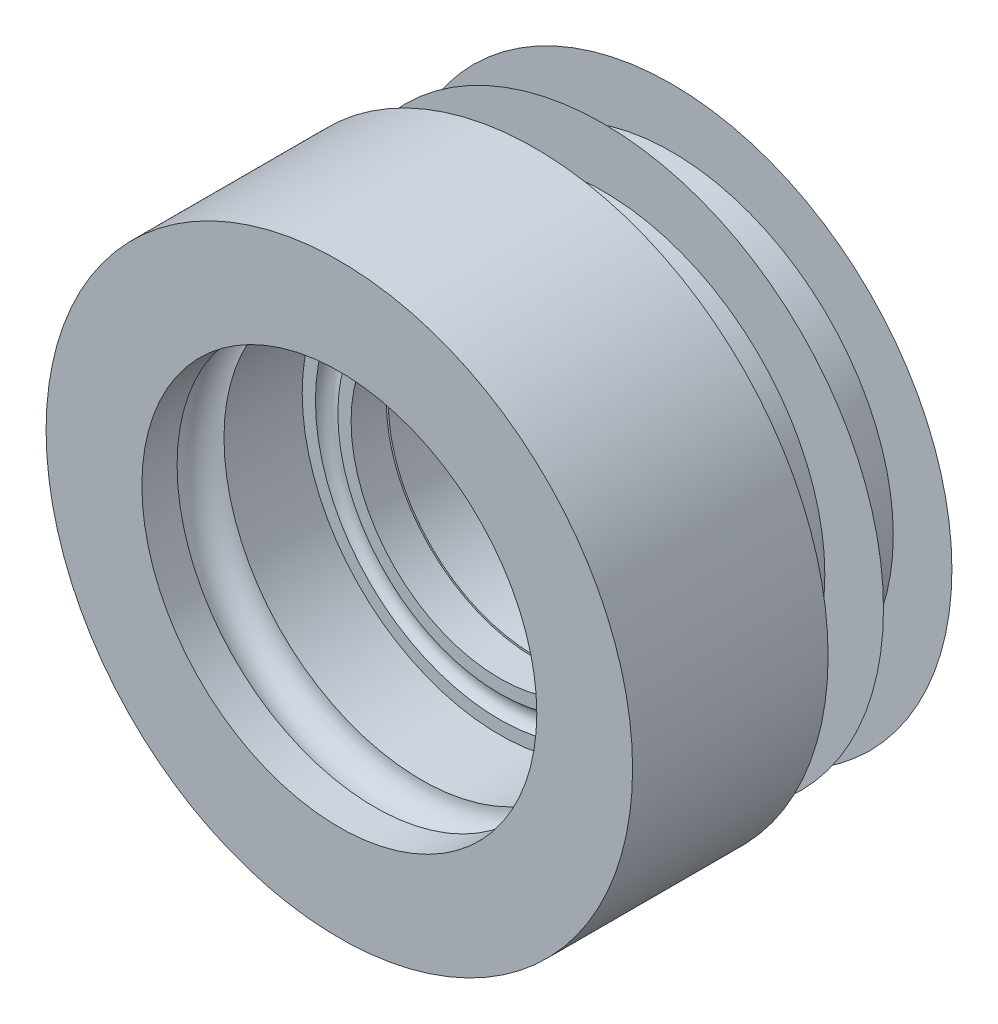
ISO-10303-21;
HEADER;
FILE_DESCRIPTION(('STEP AP214'),'2;1');
FILE_NAME('part.step','',(''),(''),'','','');
FILE_SCHEMA(('AUTOMOTIVE_DESIGN { 1 0 10303 214 1 1 1 1 }'));
ENDSEC;
DATA;
#1=APPLICATION_CONTEXT('core data for automotive mechanical design processes');
#2=APPLICATION_PROTOCOL_DEFINITION('international standard','automotive_design',2000,#1);
#3=PRODUCT_CONTEXT('',#1,'mechanical');
#4=PRODUCT('Part','Part','',(#3));
#5=PRODUCT_RELATED_PRODUCT_CATEGORY('part','',(#4));
#6=PRODUCT_DEFINITION_FORMATION('','',#4);
#7=PRODUCT_DEFINITION_CONTEXT('part definition',#1,'design');
#8=PRODUCT_DEFINITION('design','',#6,#7);
#9=PRODUCT_DEFINITION_SHAPE('','',#8);
#10=(LENGTH_UNIT() NAMED_UNIT(*) SI_UNIT(.MILLI.,.METRE.));
#11=(NAMED_UNIT(*) PLANE_ANGLE_UNIT() SI_UNIT($,.RADIAN.));
#12=(NAMED_UNIT(*) SI_UNIT($,.STERADIAN.) SOLID_ANGLE_UNIT());
#13=UNCERTAINTY_MEASURE_WITH_UNIT(LENGTH_MEASURE(1.E-05),#10,'distance_accuracy_value','');
#14=(GEOMETRIC_REPRESENTATION_CONTEXT(3) GLOBAL_UNCERTAINTY_ASSIGNED_CONTEXT((#13)) GLOBAL_UNIT_ASSIGNED_CONTEXT((#10,
#11,#12)) REPRESENTATION_CONTEXT('',''));
#15=CARTESIAN_POINT('',(0.,0.,0.));
#16=DIRECTION('',(0.,0.,1.));
#17=DIRECTION('',(1.,0.,0.));
#18=AXIS2_PLACEMENT_3D('',#15,#16,#17);
#19=CARTESIAN_POINT('',(0.,0.,-9.));
#20=DIRECTION('',(0.,0.,1.));
#21=DIRECTION('',(1.,0.,0.));
#22=AXIS2_PLACEMENT_3D('',#19,#20,#21);
#23=CYLINDRICAL_SURFACE('',#22,11.3326578733656);
#24=CARTESIAN_POINT('',(0.,0.,-5.5));
#25=DIRECTION('',(0.,0.,-1.));
#26=DIRECTION('',(-1.,0.,0.));
#27=AXIS2_PLACEMENT_3D('',#24,#25,#26);
#28=CIRCLE('',#27,11.3326578733656);
#29=CARTESIAN_POINT('',(-11.3326578733656,0.,-5.5));
#30=VERTEX_POINT('',#29);
#31=EDGE_CURVE('E160',#30,#30,#28,.T.);
#32=ORIENTED_EDGE('',*,*,#31,.T.);
#33=EDGE_LOOP('',(#32));
#34=FACE_BOUND('',#33,.T.);
#35=CARTESIAN_POINT('',(0.,0.,-7.));
#36=DIRECTION('',(0.,0.,-1.));
#37=DIRECTION('',(-1.,0.,0.));
#38=AXIS2_PLACEMENT_3D('',#35,#36,#37);
#39=CIRCLE('',#38,11.3326578733656);
#40=CARTESIAN_POINT('',(-11.3326578733656,0.,-7.));
#41=VERTEX_POINT('',#40);
#42=EDGE_CURVE('E73',#41,#41,#39,.T.);
#43=ORIENTED_EDGE('',*,*,#42,.F.);
#44=EDGE_LOOP('',(#43));
#45=FACE_BOUND('',#44,.T.);
#46=ADVANCED_FACE('F37',(#34,#45),#23,.T.);
#47=CARTESIAN_POINT('',(0.,0.,0.));
#48=DIRECTION('',(0.,0.,-1.));
#49=DIRECTION('',(-1.,0.,0.));
#50=AXIS2_PLACEMENT_3D('',#47,#48,#49);
#51=CYLINDRICAL_SURFACE('',#50,7.6);
#52=CARTESIAN_POINT('',(0.,0.,1.8));
#53=DIRECTION('',(0.,0.,-1.));
#54=DIRECTION('',(-1.,0.,0.));
#55=AXIS2_PLACEMENT_3D('',#52,#53,#54);
#56=CIRCLE('',#55,7.6);
#57=CARTESIAN_POINT('',(-7.6,0.,1.8));
#58=VERTEX_POINT('',#57);
#59=EDGE_CURVE('E77',#58,#58,#56,.T.);
#60=ORIENTED_EDGE('',*,*,#59,.F.);
#61=EDGE_LOOP('',(#60));
#62=FACE_BOUND('',#61,.T.);
#63=CARTESIAN_POINT('',(0.,0.,0.));
#64=DIRECTION('',(0.,0.,-1.));
#65=DIRECTION('',(-1.,0.,0.));
#66=AXIS2_PLACEMENT_3D('',#63,#64,#65);
#67=CIRCLE('',#66,7.6);
#68=CARTESIAN_POINT('',(-7.6,0.,0.));
#69=VERTEX_POINT('',#68);
#70=EDGE_CURVE('E10',#69,#69,#67,.F.);
#71=ORIENTED_EDGE('',*,*,#70,.F.);
#72=EDGE_LOOP('',(#71));
#73=FACE_BOUND('',#72,.T.);
#74=ADVANCED_FACE('F127',(#62,#73),#51,.F.);
#75=CARTESIAN_POINT('',(0.,-7.6,1.8));
#76=DIRECTION('',(0.,0.,-1.));
#77=DIRECTION('',(-1.,0.,0.));
#78=AXIS2_PLACEMENT_3D('',#75,#76,#77);
#79=PLANE('',#78);
#80=CARTESIAN_POINT('',(0.,0.,1.8));
#81=DIRECTION('',(0.,0.,-1.));
#82=DIRECTION('',(-1.,0.,0.));
#83=AXIS2_PLACEMENT_3D('',#80,#81,#82);
#84=CIRCLE('',#83,10.1);
#85=CARTESIAN_POINT('',(-10.1,0.,1.8));
#86=VERTEX_POINT('',#85);
#87=EDGE_CURVE('E45',#86,#86,#84,.F.);
#88=ORIENTED_EDGE('',*,*,#87,.T.);
#89=EDGE_LOOP('',(#88));
#90=FACE_BOUND('',#89,.T.);
#91=CARTESIAN_POINT('',(0.,0.,1.8));
#92=DIRECTION('',(0.,0.,-1.));
#93=DIRECTION('',(-1.,0.,0.));
#94=AXIS2_PLACEMENT_3D('',#91,#92,#93);
#95=CIRCLE('',#94,9.42282196186948);
#96=CARTESIAN_POINT('',(-9.42282196186948,0.,1.8));
#97=VERTEX_POINT('',#96);
#98=EDGE_CURVE('E53',#97,#97,#95,.T.);
#99=ORIENTED_EDGE('',*,*,#98,.T.);
#100=EDGE_LOOP('',(#99));
#101=FACE_BOUND('',#100,.T.);
#102=ADVANCED_FACE('F105',(#90,#101),#79,.F.);
#103=ORIENTED_EDGE('',*,*,#59,.T.);
#104=EDGE_LOOP('',(#103));
#105=FACE_BOUND('',#104,.T.);
#106=CARTESIAN_POINT('',(0.,0.,1.8));
#107=DIRECTION('',(0.,0.,1.));
#108=DIRECTION('',(1.,0.,0.));
#109=AXIS2_PLACEMENT_3D('',#106,#107,#108);
#110=CIRCLE('',#109,8.27717803813051);
#111=CARTESIAN_POINT('',(8.27717803813051,0.,1.8));
#112=VERTEX_POINT('',#111);
#113=EDGE_CURVE('E61',#112,#112,#110,.T.);
#114=ORIENTED_EDGE('',*,*,#113,.T.);
#115=EDGE_LOOP('',(#114));
#116=FACE_BOUND('',#115,.T.);
#117=ADVANCED_FACE('F200',(#105,#116),#79,.F.);
#118=CARTESIAN_POINT('',(0.,0.,0.));
#119=DIRECTION('',(0.,0.,1.));
#120=DIRECTION('',(1.,0.,0.));
#121=AXIS2_PLACEMENT_3D('',#118,#119,#120);
#122=CYLINDRICAL_SURFACE('',#121,10.1);
#123=CARTESIAN_POINT('',(0.,0.,5.8));
#124=DIRECTION('',(0.,0.,1.));
#125=DIRECTION('',(1.,0.,0.));
#126=AXIS2_PLACEMENT_3D('',#123,#124,#125);
#127=CIRCLE('',#126,10.1);
#128=CARTESIAN_POINT('',(10.1,0.,5.8));
#129=VERTEX_POINT('',#128);
#130=EDGE_CURVE('E91',#129,#129,#127,.T.);
#131=ORIENTED_EDGE('',*,*,#130,.T.);
#132=EDGE_LOOP('',(#131));
#133=FACE_BOUND('',#132,.T.);
#134=ORIENTED_EDGE('',*,*,#87,.F.);
#135=EDGE_LOOP('',(#134));
#136=FACE_BOUND('',#135,.T.);
#137=ADVANCED_FACE('F207',(#133,#136),#122,.F.);
#138=CARTESIAN_POINT('',(0.,0.,10.));
#139=DIRECTION('',(0.,0.,-1.));
#140=DIRECTION('',(-1.,0.,0.));
#141=AXIS2_PLACEMENT_3D('',#138,#139,#140);
#142=CYLINDRICAL_SURFACE('',#141,15.);
#143=CARTESIAN_POINT('',(0.,0.,10.));
#144=DIRECTION('',(0.,0.,1.));
#145=DIRECTION('',(1.,0.,0.));
#146=AXIS2_PLACEMENT_3D('',#143,#144,#145);
#147=CIRCLE('',#146,15.);
#148=CARTESIAN_POINT('',(15.,0.,10.));
#149=VERTEX_POINT('',#148);
#150=EDGE_CURVE('E50',#149,#149,#147,.T.);
#151=ORIENTED_EDGE('',*,*,#150,.F.);
#152=EDGE_LOOP('',(#151));
#153=FACE_BOUND('',#152,.T.);
#154=CARTESIAN_POINT('',(0.,0.,0.));
#155=DIRECTION('',(0.,0.,1.));
#156=DIRECTION('',(1.,0.,0.));
#157=AXIS2_PLACEMENT_3D('',#154,#155,#156);
#158=CIRCLE('',#157,15.);
#159=CARTESIAN_POINT('',(15.,0.,0.));
#160=VERTEX_POINT('',#159);
#161=EDGE_CURVE('E90',#160,#160,#158,.T.);
#162=ORIENTED_EDGE('',*,*,#161,.T.);
#163=EDGE_LOOP('',(#162));
#164=FACE_BOUND('',#163,.T.);
#165=ADVANCED_FACE('F39',(#153,#164),#142,.T.);
#166=CARTESIAN_POINT('',(0.,0.,10.));
#167=DIRECTION('',(0.,0.,1.));
#168=DIRECTION('',(1.,0.,0.));
#169=AXIS2_PLACEMENT_3D('',#166,#167,#168);
#170=PLANE('',#169);
#171=CARTESIAN_POINT('',(0.,0.,10.));
#172=DIRECTION('',(0.,0.,1.));
#173=DIRECTION('',(1.,0.,0.));
#174=AXIS2_PLACEMENT_3D('',#171,#172,#173);
#175=CIRCLE('',#174,10.1);
#176=CARTESIAN_POINT('',(10.1,0.,10.));
#177=VERTEX_POINT('',#176);
#178=EDGE_CURVE('E87',#177,#177,#175,.T.);
#179=ORIENTED_EDGE('',*,*,#178,.F.);
#180=EDGE_LOOP('',(#179));
#181=FACE_BOUND('',#180,.T.);
#182=ORIENTED_EDGE('',*,*,#150,.T.);
#183=EDGE_LOOP('',(#182));
#184=FACE_BOUND('',#183,.T.);
#185=ADVANCED_FACE('F208',(#181,#184),#170,.T.);
#186=CARTESIAN_POINT('',(0.,0.,0.));
#187=DIRECTION('',(0.,0.,1.));
#188=DIRECTION('',(1.,0.,0.));
#189=AXIS2_PLACEMENT_3D('',#186,#187,#188);
#190=PLANE('',#189);
#191=CARTESIAN_POINT('',(0.,0.,0.));
#192=DIRECTION('',(0.,0.,-1.));
#193=DIRECTION('',(-1.,0.,0.));
#194=AXIS2_PLACEMENT_3D('',#191,#192,#193);
#195=CIRCLE('',#194,14.3326578733656);
#196=CARTESIAN_POINT('',(-14.3326578733656,0.,0.));
#197=VERTEX_POINT('',#196);
#198=EDGE_CURVE('E217',#197,#197,#195,.T.);
#199=ORIENTED_EDGE('',*,*,#198,.F.);
#200=EDGE_LOOP('',(#199));
#201=FACE_BOUND('',#200,.T.);
#202=ORIENTED_EDGE('',*,*,#161,.F.);
#203=EDGE_LOOP('',(#202));
#204=FACE_BOUND('',#203,.T.);
#205=ADVANCED_FACE('F205',(#201,#204),#190,.F.);
#206=CARTESIAN_POINT('',(0.,0.,8.2));
#207=DIRECTION('',(0.,0.,-1.));
#208=DIRECTION('',(-1.,0.,0.));
#209=AXIS2_PLACEMENT_3D('',#206,#207,#208);
#210=CIRCLE('',#209,10.1);
#211=CARTESIAN_POINT('',(-10.1,0.,8.2));
#212=VERTEX_POINT('',#211);
#213=EDGE_CURVE('E86',#212,#212,#210,.T.);
#214=ORIENTED_EDGE('',*,*,#213,.T.);
#215=EDGE_LOOP('',(#214));
#216=FACE_BOUND('',#215,.T.);
#217=ORIENTED_EDGE('',*,*,#178,.T.);
#218=EDGE_LOOP('',(#217));
#219=FACE_BOUND('',#218,.T.);
#220=ADVANCED_FACE('F121',(#216,#219),#122,.F.);
#221=CARTESIAN_POINT('',(0.,0.,7.));
#222=DIRECTION('',(0.,0.,-1.));
#223=DIRECTION('',(-1.,0.,0.));
#224=AXIS2_PLACEMENT_3D('',#221,#222,#223);
#225=TOROIDAL_SURFACE('',#224,10.1,1.2);
#226=ORIENTED_EDGE('',*,*,#213,.F.);
#227=EDGE_LOOP('',(#226));
#228=FACE_BOUND('',#227,.T.);
#229=ORIENTED_EDGE('',*,*,#130,.F.);
#230=EDGE_LOOP('',(#229));
#231=FACE_BOUND('',#230,.T.);
#232=ADVANCED_FACE('F110',(#228,#231),#225,.F.);
#233=CARTESIAN_POINT('',(0.,0.,2.05));
#234=DIRECTION('',(0.,0.,-1.));
#235=DIRECTION('',(-1.,0.,0.));
#236=AXIS2_PLACEMENT_3D('',#233,#234,#235);
#237=TOROIDAL_SURFACE('',#236,8.85,0.625000000000002);
#238=ORIENTED_EDGE('',*,*,#113,.F.);
#239=EDGE_LOOP('',(#238));
#240=FACE_BOUND('',#239,.T.);
#241=ORIENTED_EDGE('',*,*,#98,.F.);
#242=EDGE_LOOP('',(#241));
#243=FACE_BOUND('',#242,.T.);
#244=ADVANCED_FACE('F107',(#240,#243),#237,.F.);
#245=CARTESIAN_POINT('',(0.,0.,0.));
#246=DIRECTION('',(0.,0.,-1.));
#247=DIRECTION('',(-1.,0.,0.));
#248=AXIS2_PLACEMENT_3D('',#245,#246,#247);
#249=PLANE('',#248);
#250=CARTESIAN_POINT('',(0.,0.,0.));
#251=DIRECTION('',(0.,0.,-1.));
#252=DIRECTION('',(-1.,0.,0.));
#253=AXIS2_PLACEMENT_3D('',#250,#251,#252);
#254=CIRCLE('',#253,7.5);
#255=CARTESIAN_POINT('',(-7.5,0.,0.));
#256=VERTEX_POINT('',#255);
#257=EDGE_CURVE('E41',#256,#256,#254,.T.);
#258=ORIENTED_EDGE('',*,*,#257,.T.);
#259=EDGE_LOOP('',(#258));
#260=FACE_BOUND('',#259,.T.);
#261=ORIENTED_EDGE('',*,*,#70,.T.);
#262=EDGE_LOOP('',(#261));
#263=FACE_BOUND('',#262,.T.);
#264=ADVANCED_FACE('F109',(#260,#263),#249,.F.);
#265=CARTESIAN_POINT('',(0.,0.,-9.));
#266=DIRECTION('',(0.,0.,-1.));
#267=DIRECTION('',(-1.,0.,0.));
#268=AXIS2_PLACEMENT_3D('',#265,#266,#267);
#269=PLANE('',#268);
#270=CARTESIAN_POINT('',(0.,0.,-9.));
#271=DIRECTION('',(0.,0.,-1.));
#272=DIRECTION('',(-1.,0.,0.));
#273=AXIS2_PLACEMENT_3D('',#270,#271,#272);
#274=CIRCLE('',#273,11.3326578733656);
#275=CARTESIAN_POINT('',(-11.3326578733656,0.,-9.));
#276=VERTEX_POINT('',#275);
#277=EDGE_CURVE('E68',#276,#276,#274,.T.);
#278=ORIENTED_EDGE('',*,*,#277,.T.);
#279=EDGE_LOOP('',(#278));
#280=FACE_BOUND('',#279,.T.);
#281=CARTESIAN_POINT('',(0.,0.,-9.));
#282=DIRECTION('',(0.,0.,-1.));
#283=DIRECTION('',(-1.,0.,0.));
#284=AXIS2_PLACEMENT_3D('',#281,#282,#283);
#285=CIRCLE('',#284,11.1);
#286=CARTESIAN_POINT('',(-11.1,0.,-9.));
#287=VERTEX_POINT('',#286);
#288=EDGE_CURVE('E57',#287,#287,#285,.T.);
#289=ORIENTED_EDGE('',*,*,#288,.F.);
#290=EDGE_LOOP('',(#289));
#291=FACE_BOUND('',#290,.T.);
#292=ADVANCED_FACE('F118',(#280,#291),#269,.T.);
#293=CARTESIAN_POINT('',(0.,0.,-2.));
#294=DIRECTION('',(0.,0.,-1.));
#295=DIRECTION('',(-1.,0.,0.));
#296=AXIS2_PLACEMENT_3D('',#293,#294,#295);
#297=CIRCLE('',#296,11.3326578733656);
#298=CARTESIAN_POINT('',(-11.3326578733656,0.,-2.));
#299=VERTEX_POINT('',#298);
#300=EDGE_CURVE('E155',#299,#299,#297,.T.);
#301=ORIENTED_EDGE('',*,*,#300,.T.);
#302=EDGE_LOOP('',(#301));
#303=FACE_BOUND('',#302,.T.);
#304=CARTESIAN_POINT('',(0.,0.,-3.5));
#305=DIRECTION('',(0.,0.,-1.));
#306=DIRECTION('',(-1.,0.,0.));
#307=AXIS2_PLACEMENT_3D('',#304,#305,#306);
#308=CIRCLE('',#307,11.3326578733656);
#309=CARTESIAN_POINT('',(-11.3326578733656,0.,-3.5));
#310=VERTEX_POINT('',#309);
#311=EDGE_CURVE('E158',#310,#310,#308,.T.);
#312=ORIENTED_EDGE('',*,*,#311,.F.);
#313=EDGE_LOOP('',(#312));
#314=FACE_BOUND('',#313,.T.);
#315=ADVANCED_FACE('F129',(#303,#314),#23,.T.);
#316=CARTESIAN_POINT('',(0.,0.,0.));
#317=DIRECTION('',(0.,0.,-1.));
#318=DIRECTION('',(-1.,0.,0.));
#319=AXIS2_PLACEMENT_3D('',#316,#317,#318);
#320=CYLINDRICAL_SURFACE('',#319,11.1);
#321=ORIENTED_EDGE('',*,*,#288,.T.);
#322=EDGE_LOOP('',(#321));
#323=FACE_BOUND('',#322,.T.);
#324=CARTESIAN_POINT('',(0.,0.,-9.2));
#325=DIRECTION('',(0.,0.,-1.));
#326=DIRECTION('',(-1.,0.,0.));
#327=AXIS2_PLACEMENT_3D('',#324,#325,#326);
#328=CIRCLE('',#327,11.1);
#329=CARTESIAN_POINT('',(-11.1,0.,-9.2));
#330=VERTEX_POINT('',#329);
#331=EDGE_CURVE('E83',#330,#330,#328,.T.);
#332=ORIENTED_EDGE('',*,*,#331,.F.);
#333=EDGE_LOOP('',(#332));
#334=FACE_BOUND('',#333,.T.);
#335=ADVANCED_FACE('F139',(#323,#334),#320,.T.);
#336=CARTESIAN_POINT('',(0.,-7.6,-9.2));
#337=DIRECTION('',(0.,0.,1.));
#338=DIRECTION('',(1.,0.,0.));
#339=AXIS2_PLACEMENT_3D('',#336,#337,#338);
#340=PLANE('',#339);
#341=CARTESIAN_POINT('',(0.,0.,-9.2));
#342=DIRECTION('',(0.,0.,-1.));
#343=DIRECTION('',(-1.,0.,0.));
#344=AXIS2_PLACEMENT_3D('',#341,#342,#343);
#345=CIRCLE('',#344,7.6);
#346=CARTESIAN_POINT('',(-7.6,0.,-9.2));
#347=VERTEX_POINT('',#346);
#348=EDGE_CURVE('E80',#347,#347,#345,.T.);
#349=ORIENTED_EDGE('',*,*,#348,.F.);
#350=EDGE_LOOP('',(#349));
#351=FACE_BOUND('',#350,.T.);
#352=ORIENTED_EDGE('',*,*,#331,.T.);
#353=EDGE_LOOP('',(#352));
#354=FACE_BOUND('',#353,.T.);
#355=ADVANCED_FACE('F145',(#351,#354),#340,.F.);
#356=CARTESIAN_POINT('',(0.,0.,-9.));
#357=DIRECTION('',(0.,0.,-1.));
#358=DIRECTION('',(-1.,0.,0.));
#359=AXIS2_PLACEMENT_3D('',#356,#357,#358);
#360=CIRCLE('',#359,7.6);
#361=CARTESIAN_POINT('',(-7.6,0.,-9.));
#362=VERTEX_POINT('',#361);
#363=EDGE_CURVE('E55',#362,#362,#360,.F.);
#364=ORIENTED_EDGE('',*,*,#363,.T.);
#365=EDGE_LOOP('',(#364));
#366=FACE_BOUND('',#365,.T.);
#367=ORIENTED_EDGE('',*,*,#348,.T.);
#368=EDGE_LOOP('',(#367));
#369=FACE_BOUND('',#368,.T.);
#370=ADVANCED_FACE('F135',(#366,#369),#51,.F.);
#371=CARTESIAN_POINT('',(0.,0.,-9.));
#372=DIRECTION('',(0.,0.,-1.));
#373=DIRECTION('',(-1.,0.,0.));
#374=AXIS2_PLACEMENT_3D('',#371,#372,#373);
#375=CIRCLE('',#374,7.5);
#376=CARTESIAN_POINT('',(-7.5,0.,-9.));
#377=VERTEX_POINT('',#376);
#378=EDGE_CURVE('E64',#377,#377,#375,.T.);
#379=ORIENTED_EDGE('',*,*,#378,.F.);
#380=EDGE_LOOP('',(#379));
#381=FACE_BOUND('',#380,.T.);
#382=ORIENTED_EDGE('',*,*,#363,.F.);
#383=EDGE_LOOP('',(#382));
#384=FACE_BOUND('',#383,.T.);
#385=ADVANCED_FACE('F151',(#381,#384),#269,.T.);
#386=CARTESIAN_POINT('',(0.,0.,10.));
#387=DIRECTION('',(0.,0.,-1.));
#388=DIRECTION('',(-1.,0.,0.));
#389=AXIS2_PLACEMENT_3D('',#386,#387,#388);
#390=CYLINDRICAL_SURFACE('',#389,7.5);
#391=ORIENTED_EDGE('',*,*,#378,.T.);
#392=EDGE_LOOP('',(#391));
#393=FACE_BOUND('',#392,.T.);
#394=ORIENTED_EDGE('',*,*,#257,.F.);
#395=EDGE_LOOP('',(#394));
#396=FACE_BOUND('',#395,.T.);
#397=ADVANCED_FACE('F182',(#393,#396),#390,.F.);
#398=CARTESIAN_POINT('',(0.,0.,-9.));
#399=DIRECTION('',(0.,0.,1.));
#400=DIRECTION('',(1.,0.,0.));
#401=AXIS2_PLACEMENT_3D('',#398,#399,#400);
#402=CONICAL_SURFACE('',#401,11.3326578733656,0.982793723247329);
#403=CARTESIAN_POINT('',(0.,0.,-7.));
#404=DIRECTION('',(0.,0.,-1.));
#405=DIRECTION('',(-1.,0.,0.));
#406=AXIS2_PLACEMENT_3D('',#403,#404,#405);
#407=CIRCLE('',#406,14.3326578733656);
#408=CARTESIAN_POINT('',(-14.3326578733656,0.,-7.));
#409=VERTEX_POINT('',#408);
#410=EDGE_CURVE('E163',#409,#409,#407,.T.);
#411=ORIENTED_EDGE('',*,*,#410,.T.);
#412=EDGE_LOOP('',(#411));
#413=FACE_BOUND('',#412,.T.);
#414=ORIENTED_EDGE('',*,*,#277,.F.);
#415=EDGE_LOOP('',(#414));
#416=FACE_BOUND('',#415,.T.);
#417=ADVANCED_FACE('F176',(#413,#416),#402,.T.);
#418=CARTESIAN_POINT('',(0.,11.3326578733656,-7.));
#419=DIRECTION('',(0.,0.,1.));
#420=DIRECTION('',(1.,0.,0.));
#421=AXIS2_PLACEMENT_3D('',#418,#419,#420);
#422=PLANE('',#421);
#423=ORIENTED_EDGE('',*,*,#42,.T.);
#424=EDGE_LOOP('',(#423));
#425=FACE_BOUND('',#424,.T.);
#426=ORIENTED_EDGE('',*,*,#410,.F.);
#427=EDGE_LOOP('',(#426));
#428=FACE_BOUND('',#427,.T.);
#429=ADVANCED_FACE('F173',(#425,#428),#422,.T.);
#430=CARTESIAN_POINT('',(0.,0.,-5.5));
#431=DIRECTION('',(0.,0.,1.));
#432=DIRECTION('',(1.,0.,0.));
#433=AXIS2_PLACEMENT_3D('',#430,#431,#432);
#434=CONICAL_SURFACE('',#433,11.3326578733656,0.982793723247329);
#435=CARTESIAN_POINT('',(0.,0.,-3.5));
#436=DIRECTION('',(0.,0.,-1.));
#437=DIRECTION('',(-1.,0.,0.));
#438=AXIS2_PLACEMENT_3D('',#435,#436,#437);
#439=CIRCLE('',#438,14.3326578733656);
#440=CARTESIAN_POINT('',(-14.3326578733656,0.,-3.5));
#441=VERTEX_POINT('',#440);
#442=EDGE_CURVE('E161',#441,#441,#439,.T.);
#443=ORIENTED_EDGE('',*,*,#442,.T.);
#444=EDGE_LOOP('',(#443));
#445=FACE_BOUND('',#444,.T.);
#446=ORIENTED_EDGE('',*,*,#31,.F.);
#447=EDGE_LOOP('',(#446));
#448=FACE_BOUND('',#447,.T.);
#449=ADVANCED_FACE('F175',(#445,#448),#434,.T.);
#450=CARTESIAN_POINT('',(0.,11.3326578733656,-3.5));
#451=DIRECTION('',(0.,0.,1.));
#452=DIRECTION('',(1.,0.,0.));
#453=AXIS2_PLACEMENT_3D('',#450,#451,#452);
#454=PLANE('',#453);
#455=ORIENTED_EDGE('',*,*,#311,.T.);
#456=EDGE_LOOP('',(#455));
#457=FACE_BOUND('',#456,.T.);
#458=ORIENTED_EDGE('',*,*,#442,.F.);
#459=EDGE_LOOP('',(#458));
#460=FACE_BOUND('',#459,.T.);
#461=ADVANCED_FACE('F303',(#457,#460),#454,.T.);
#462=CARTESIAN_POINT('',(0.,0.,-2.));
#463=DIRECTION('',(0.,0.,1.));
#464=DIRECTION('',(1.,0.,0.));
#465=AXIS2_PLACEMENT_3D('',#462,#463,#464);
#466=CONICAL_SURFACE('',#465,11.3326578733656,0.982793723247329);
#467=ORIENTED_EDGE('',*,*,#198,.T.);
#468=EDGE_LOOP('',(#467));
#469=FACE_BOUND('',#468,.T.);
#470=ORIENTED_EDGE('',*,*,#300,.F.);
#471=EDGE_LOOP('',(#470));
#472=FACE_BOUND('',#471,.T.);
#473=ADVANCED_FACE('F312',(#469,#472),#466,.T.);
#474=CLOSED_SHELL('',(#46,#74,#102,#117,#137,#165,#185,#205,#220,#232,#244,#264,#292,#315,#335,
#355,#370,#385,#397,#417,#429,#449,#461,#473));
#475=MANIFOLD_SOLID_BREP('B2',#474);
#476=ADVANCED_BREP_SHAPE_REPRESENTATION('',(#18,#475),#14);
#477=SHAPE_DEFINITION_REPRESENTATION(#9,#476);
ENDSEC;
END-ISO-10303-21;
